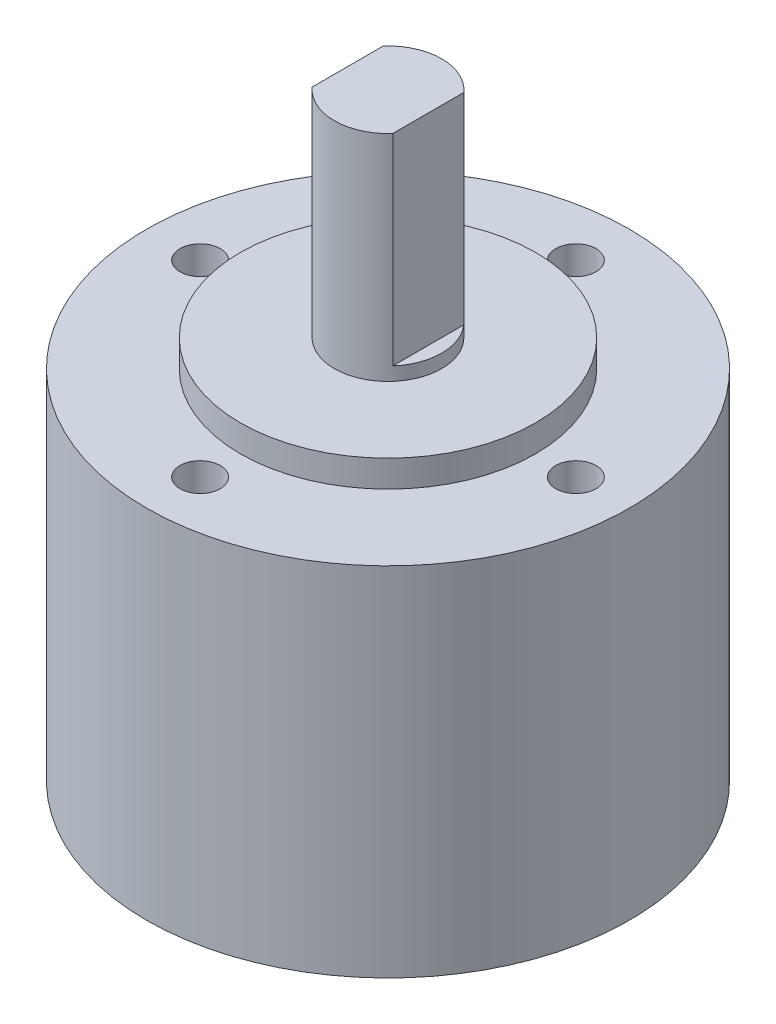
ISO-10303-21;
HEADER;
FILE_DESCRIPTION(('STEP AP214'),'2;1');
FILE_NAME('part.step','',(''),(''),'','','');
FILE_SCHEMA(('AUTOMOTIVE_DESIGN { 1 0 10303 214 1 1 1 1 }'));
ENDSEC;
DATA;
#1=APPLICATION_CONTEXT('core data for automotive mechanical design processes');
#2=APPLICATION_PROTOCOL_DEFINITION('international standard','automotive_design',2000,#1);
#3=PRODUCT_CONTEXT('',#1,'mechanical');
#4=PRODUCT('Part','Part','',(#3));
#5=PRODUCT_RELATED_PRODUCT_CATEGORY('part','',(#4));
#6=PRODUCT_DEFINITION_FORMATION('','',#4);
#7=PRODUCT_DEFINITION_CONTEXT('part definition',#1,'design');
#8=PRODUCT_DEFINITION('design','',#6,#7);
#9=PRODUCT_DEFINITION_SHAPE('','',#8);
#10=(LENGTH_UNIT() NAMED_UNIT(*) SI_UNIT(.MILLI.,.METRE.));
#11=(NAMED_UNIT(*) PLANE_ANGLE_UNIT() SI_UNIT($,.RADIAN.));
#12=(NAMED_UNIT(*) SI_UNIT($,.STERADIAN.) SOLID_ANGLE_UNIT());
#13=UNCERTAINTY_MEASURE_WITH_UNIT(LENGTH_MEASURE(1.E-05),#10,'distance_accuracy_value','');
#14=(GEOMETRIC_REPRESENTATION_CONTEXT(3) GLOBAL_UNCERTAINTY_ASSIGNED_CONTEXT((#13)) GLOBAL_UNIT_ASSIGNED_CONTEXT((#10,
#11,#12)) REPRESENTATION_CONTEXT('',''));
#15=CARTESIAN_POINT('',(0.,0.,0.));
#16=DIRECTION('',(0.,0.,1.));
#17=DIRECTION('',(1.,0.,0.));
#18=AXIS2_PLACEMENT_3D('',#15,#16,#17);
#19=CARTESIAN_POINT('',(0.,13.3,0.));
#20=DIRECTION('',(0.,-1.,0.));
#21=DIRECTION('',(0.,0.,-1.));
#22=AXIS2_PLACEMENT_3D('',#19,#20,#21);
#23=CYLINDRICAL_SURFACE('',#22,18.);
#24=CARTESIAN_POINT('',(0.,13.3,0.));
#25=DIRECTION('',(0.,1.,0.));
#26=DIRECTION('',(0.,0.,1.));
#27=AXIS2_PLACEMENT_3D('',#24,#25,#26);
#28=CIRCLE('',#27,18.);
#29=CARTESIAN_POINT('',(0.,13.3,18.));
#30=VERTEX_POINT('',#29);
#31=EDGE_CURVE('E113',#30,#30,#28,.T.);
#32=ORIENTED_EDGE('',*,*,#31,.F.);
#33=EDGE_LOOP('',(#32));
#34=FACE_BOUND('',#33,.T.);
#35=CARTESIAN_POINT('',(0.,-13.3,0.));
#36=DIRECTION('',(0.,1.,0.));
#37=DIRECTION('',(0.,0.,1.));
#38=AXIS2_PLACEMENT_3D('',#35,#36,#37);
#39=CIRCLE('',#38,18.);
#40=CARTESIAN_POINT('',(0.,-13.3,18.));
#41=VERTEX_POINT('',#40);
#42=EDGE_CURVE('E109',#41,#41,#39,.T.);
#43=ORIENTED_EDGE('',*,*,#42,.T.);
#44=EDGE_LOOP('',(#43));
#45=FACE_BOUND('',#44,.T.);
#46=ADVANCED_FACE('F42',(#34,#45),#23,.T.);
#47=CARTESIAN_POINT('',(0.,13.3,0.));
#48=DIRECTION('',(0.,1.,0.));
#49=DIRECTION('',(0.,0.,1.));
#50=AXIS2_PLACEMENT_3D('',#47,#48,#49);
#51=PLANE('',#50);
#52=CARTESIAN_POINT('',(-14.,13.3,0.));
#53=DIRECTION('',(0.,1.,0.));
#54=DIRECTION('',(0.,0.,1.));
#55=AXIS2_PLACEMENT_3D('',#52,#53,#54);
#56=CIRCLE('',#55,1.5);
#57=CARTESIAN_POINT('',(-14.,13.3,1.5));
#58=VERTEX_POINT('',#57);
#59=EDGE_CURVE('E125',#58,#58,#56,.T.);
#60=ORIENTED_EDGE('',*,*,#59,.F.);
#61=EDGE_LOOP('',(#60));
#62=FACE_BOUND('',#61,.T.);
#63=CARTESIAN_POINT('',(0.,13.3,14.));
#64=DIRECTION('',(0.,1.,0.));
#65=DIRECTION('',(0.,0.,1.));
#66=AXIS2_PLACEMENT_3D('',#63,#64,#65);
#67=CIRCLE('',#66,1.5);
#68=CARTESIAN_POINT('',(0.,13.3,15.5));
#69=VERTEX_POINT('',#68);
#70=EDGE_CURVE('E129',#69,#69,#67,.T.);
#71=ORIENTED_EDGE('',*,*,#70,.F.);
#72=EDGE_LOOP('',(#71));
#73=FACE_BOUND('',#72,.T.);
#74=CARTESIAN_POINT('',(14.,13.3,0.));
#75=DIRECTION('',(0.,1.,0.));
#76=DIRECTION('',(0.,0.,1.));
#77=AXIS2_PLACEMENT_3D('',#74,#75,#76);
#78=CIRCLE('',#77,1.5);
#79=CARTESIAN_POINT('',(14.,13.3,1.5));
#80=VERTEX_POINT('',#79);
#81=EDGE_CURVE('E133',#80,#80,#78,.T.);
#82=ORIENTED_EDGE('',*,*,#81,.F.);
#83=EDGE_LOOP('',(#82));
#84=FACE_BOUND('',#83,.T.);
#85=CARTESIAN_POINT('',(0.,13.3,-14.));
#86=DIRECTION('',(0.,1.,0.));
#87=DIRECTION('',(0.,0.,1.));
#88=AXIS2_PLACEMENT_3D('',#85,#86,#87);
#89=CIRCLE('',#88,1.5);
#90=CARTESIAN_POINT('',(0.,13.3,-12.5));
#91=VERTEX_POINT('',#90);
#92=EDGE_CURVE('E137',#91,#91,#89,.T.);
#93=ORIENTED_EDGE('',*,*,#92,.F.);
#94=EDGE_LOOP('',(#93));
#95=FACE_BOUND('',#94,.T.);
#96=CARTESIAN_POINT('',(0.,13.3,0.));
#97=DIRECTION('',(0.,1.,0.));
#98=DIRECTION('',(0.,0.,1.));
#99=AXIS2_PLACEMENT_3D('',#96,#97,#98);
#100=CIRCLE('',#99,11.);
#101=CARTESIAN_POINT('',(0.,13.3,11.));
#102=VERTEX_POINT('',#101);
#103=EDGE_CURVE('E118',#102,#102,#100,.T.);
#104=ORIENTED_EDGE('',*,*,#103,.F.);
#105=EDGE_LOOP('',(#104));
#106=FACE_BOUND('',#105,.T.);
#107=ORIENTED_EDGE('',*,*,#31,.T.);
#108=EDGE_LOOP('',(#107));
#109=FACE_BOUND('',#108,.T.);
#110=ADVANCED_FACE('F192',(#62,#73,#84,#95,#106,#109),#51,.T.);
#111=CARTESIAN_POINT('',(0.,-13.3,0.));
#112=DIRECTION('',(0.,1.,0.));
#113=DIRECTION('',(0.,0.,1.));
#114=AXIS2_PLACEMENT_3D('',#111,#112,#113);
#115=PLANE('',#114);
#116=CARTESIAN_POINT('',(-14.,-13.3,0.));
#117=DIRECTION('',(0.,1.,0.));
#118=DIRECTION('',(0.,0.,1.));
#119=AXIS2_PLACEMENT_3D('',#116,#117,#118);
#120=CIRCLE('',#119,1.5);
#121=CARTESIAN_POINT('',(-14.,-13.3,1.5));
#122=VERTEX_POINT('',#121);
#123=EDGE_CURVE('E141',#122,#122,#120,.T.);
#124=ORIENTED_EDGE('',*,*,#123,.T.);
#125=EDGE_LOOP('',(#124));
#126=FACE_BOUND('',#125,.T.);
#127=CARTESIAN_POINT('',(0.,-13.3,14.));
#128=DIRECTION('',(0.,1.,0.));
#129=DIRECTION('',(0.,0.,1.));
#130=AXIS2_PLACEMENT_3D('',#127,#128,#129);
#131=CIRCLE('',#130,1.5);
#132=CARTESIAN_POINT('',(0.,-13.3,15.5));
#133=VERTEX_POINT('',#132);
#134=EDGE_CURVE('E151',#133,#133,#131,.T.);
#135=ORIENTED_EDGE('',*,*,#134,.T.);
#136=EDGE_LOOP('',(#135));
#137=FACE_BOUND('',#136,.T.);
#138=CARTESIAN_POINT('',(14.,-13.3,0.));
#139=DIRECTION('',(0.,1.,0.));
#140=DIRECTION('',(0.,0.,1.));
#141=AXIS2_PLACEMENT_3D('',#138,#139,#140);
#142=CIRCLE('',#141,1.5);
#143=CARTESIAN_POINT('',(14.,-13.3,1.5));
#144=VERTEX_POINT('',#143);
#145=EDGE_CURVE('E146',#144,#144,#142,.T.);
#146=ORIENTED_EDGE('',*,*,#145,.T.);
#147=EDGE_LOOP('',(#146));
#148=FACE_BOUND('',#147,.T.);
#149=CARTESIAN_POINT('',(0.,-13.3,-14.));
#150=DIRECTION('',(0.,1.,0.));
#151=DIRECTION('',(0.,0.,1.));
#152=AXIS2_PLACEMENT_3D('',#149,#150,#151);
#153=CIRCLE('',#152,1.5);
#154=CARTESIAN_POINT('',(0.,-13.3,-12.5));
#155=VERTEX_POINT('',#154);
#156=EDGE_CURVE('E142',#155,#155,#153,.T.);
#157=ORIENTED_EDGE('',*,*,#156,.T.);
#158=EDGE_LOOP('',(#157));
#159=FACE_BOUND('',#158,.T.);
#160=ORIENTED_EDGE('',*,*,#42,.F.);
#161=EDGE_LOOP('',(#160));
#162=FACE_BOUND('',#161,.T.);
#163=ADVANCED_FACE('F197',(#126,#137,#148,#159,#162),#115,.F.);
#164=CARTESIAN_POINT('',(0.,15.3,0.));
#165=DIRECTION('',(0.,-1.,0.));
#166=DIRECTION('',(0.,0.,-1.));
#167=AXIS2_PLACEMENT_3D('',#164,#165,#166);
#168=CYLINDRICAL_SURFACE('',#167,11.);
#169=CARTESIAN_POINT('',(0.,15.3,0.));
#170=DIRECTION('',(0.,1.,0.));
#171=DIRECTION('',(0.,0.,1.));
#172=AXIS2_PLACEMENT_3D('',#169,#170,#171);
#173=CIRCLE('',#172,11.);
#174=CARTESIAN_POINT('',(0.,15.3,11.));
#175=VERTEX_POINT('',#174);
#176=EDGE_CURVE('E114',#175,#175,#173,.T.);
#177=ORIENTED_EDGE('',*,*,#176,.F.);
#178=EDGE_LOOP('',(#177));
#179=FACE_BOUND('',#178,.T.);
#180=ORIENTED_EDGE('',*,*,#103,.T.);
#181=EDGE_LOOP('',(#180));
#182=FACE_BOUND('',#181,.T.);
#183=ADVANCED_FACE('F205',(#179,#182),#168,.T.);
#184=CARTESIAN_POINT('',(0.,15.3,0.));
#185=DIRECTION('',(0.,1.,0.));
#186=DIRECTION('',(0.,0.,1.));
#187=AXIS2_PLACEMENT_3D('',#184,#185,#186);
#188=PLANE('',#187);
#189=CARTESIAN_POINT('',(0.,15.3,0.));
#190=DIRECTION('',(0.,1.,0.));
#191=DIRECTION('',(0.,0.,1.));
#192=AXIS2_PLACEMENT_3D('',#189,#190,#191);
#193=CIRCLE('',#192,4.);
#194=CARTESIAN_POINT('',(0.,15.3,4.));
#195=VERTEX_POINT('',#194);
#196=EDGE_CURVE('E108',#195,#195,#193,.T.);
#197=ORIENTED_EDGE('',*,*,#196,.F.);
#198=EDGE_LOOP('',(#197));
#199=FACE_BOUND('',#198,.T.);
#200=ORIENTED_EDGE('',*,*,#176,.T.);
#201=EDGE_LOOP('',(#200));
#202=FACE_BOUND('',#201,.T.);
#203=ADVANCED_FACE('F210',(#199,#202),#188,.T.);
#204=CARTESIAN_POINT('',(0.,-13.3,-14.));
#205=DIRECTION('',(0.,1.,0.));
#206=DIRECTION('',(0.,0.,1.));
#207=AXIS2_PLACEMENT_3D('',#204,#205,#206);
#208=CYLINDRICAL_SURFACE('',#207,1.5);
#209=ORIENTED_EDGE('',*,*,#92,.T.);
#210=EDGE_LOOP('',(#209));
#211=FACE_BOUND('',#210,.T.);
#212=ORIENTED_EDGE('',*,*,#156,.F.);
#213=EDGE_LOOP('',(#212));
#214=FACE_BOUND('',#213,.T.);
#215=ADVANCED_FACE('F217',(#211,#214),#208,.F.);
#216=CARTESIAN_POINT('',(14.,-13.3,0.));
#217=DIRECTION('',(0.,1.,0.));
#218=DIRECTION('',(0.,0.,1.));
#219=AXIS2_PLACEMENT_3D('',#216,#217,#218);
#220=CYLINDRICAL_SURFACE('',#219,1.5);
#221=ORIENTED_EDGE('',*,*,#81,.T.);
#222=EDGE_LOOP('',(#221));
#223=FACE_BOUND('',#222,.T.);
#224=ORIENTED_EDGE('',*,*,#145,.F.);
#225=EDGE_LOOP('',(#224));
#226=FACE_BOUND('',#225,.T.);
#227=ADVANCED_FACE('F221',(#223,#226),#220,.F.);
#228=CARTESIAN_POINT('',(0.,-13.3,14.));
#229=DIRECTION('',(0.,1.,0.));
#230=DIRECTION('',(0.,0.,1.));
#231=AXIS2_PLACEMENT_3D('',#228,#229,#230);
#232=CYLINDRICAL_SURFACE('',#231,1.5);
#233=ORIENTED_EDGE('',*,*,#70,.T.);
#234=EDGE_LOOP('',(#233));
#235=FACE_BOUND('',#234,.T.);
#236=ORIENTED_EDGE('',*,*,#134,.F.);
#237=EDGE_LOOP('',(#236));
#238=FACE_BOUND('',#237,.T.);
#239=ADVANCED_FACE('F225',(#235,#238),#232,.F.);
#240=CARTESIAN_POINT('',(-14.,-13.3,0.));
#241=DIRECTION('',(0.,1.,0.));
#242=DIRECTION('',(0.,0.,1.));
#243=AXIS2_PLACEMENT_3D('',#240,#241,#242);
#244=CYLINDRICAL_SURFACE('',#243,1.5);
#245=ORIENTED_EDGE('',*,*,#59,.T.);
#246=EDGE_LOOP('',(#245));
#247=FACE_BOUND('',#246,.T.);
#248=ORIENTED_EDGE('',*,*,#123,.F.);
#249=EDGE_LOOP('',(#248));
#250=FACE_BOUND('',#249,.T.);
#251=ADVANCED_FACE('F188',(#247,#250),#244,.F.);
#252=CARTESIAN_POINT('',(0.,31.3,0.));
#253=DIRECTION('',(0.,-1.,0.));
#254=DIRECTION('',(0.,0.,-1.));
#255=AXIS2_PLACEMENT_3D('',#252,#253,#254);
#256=CYLINDRICAL_SURFACE('',#255,4.);
#257=CARTESIAN_POINT('',(0.,31.3,0.));
#258=DIRECTION('',(0.,1.,0.));
#259=DIRECTION('',(0.,0.,1.));
#260=AXIS2_PLACEMENT_3D('',#257,#258,#259);
#261=CIRCLE('',#260,4.);
#262=CARTESIAN_POINT('',(-3.,31.3,2.64575131106459));
#263=VERTEX_POINT('',#262);
#264=CARTESIAN_POINT('',(3.,31.3,2.64575131106459));
#265=VERTEX_POINT('',#264);
#266=EDGE_CURVE('E161',#263,#265,#261,.T.);
#267=ORIENTED_EDGE('',*,*,#266,.F.);
#268=DIRECTION('',(0.,-1.,0.));
#269=VECTOR('',#268,1.);
#270=CARTESIAN_POINT('',(-3.,31.3,2.64575131106459));
#271=LINE('',#270,#269);
#272=CARTESIAN_POINT('',(-3.,16.3,2.64575131106459));
#273=VERTEX_POINT('',#272);
#274=EDGE_CURVE('E57',#263,#273,#271,.T.);
#275=ORIENTED_EDGE('',*,*,#274,.T.);
#276=CARTESIAN_POINT('',(0.,16.3,0.));
#277=DIRECTION('',(0.,1.,0.));
#278=DIRECTION('',(0.,0.,1.));
#279=AXIS2_PLACEMENT_3D('',#276,#277,#278);
#280=CIRCLE('',#279,4.);
#281=CARTESIAN_POINT('',(-3.,16.3,-2.64575131106459));
#282=VERTEX_POINT('',#281);
#283=EDGE_CURVE('E13',#282,#273,#280,.T.);
#284=ORIENTED_EDGE('',*,*,#283,.F.);
#285=DIRECTION('',(0.,-1.,0.));
#286=VECTOR('',#285,1.);
#287=CARTESIAN_POINT('',(-3.,31.3,-2.64575131106459));
#288=LINE('',#287,#286);
#289=CARTESIAN_POINT('',(-3.,31.3,-2.64575131106459));
#290=VERTEX_POINT('',#289);
#291=EDGE_CURVE('E166',#282,#290,#288,.F.);
#292=ORIENTED_EDGE('',*,*,#291,.T.);
#293=CARTESIAN_POINT('',(3.,31.3,-2.64575131106459));
#294=VERTEX_POINT('',#293);
#295=EDGE_CURVE('E147',#294,#290,#261,.T.);
#296=ORIENTED_EDGE('',*,*,#295,.F.);
#297=DIRECTION('',(0.,-1.,0.));
#298=VECTOR('',#297,1.);
#299=CARTESIAN_POINT('',(3.,31.3,-2.64575131106459));
#300=LINE('',#299,#298);
#301=CARTESIAN_POINT('',(3.,16.3,-2.64575131106459));
#302=VERTEX_POINT('',#301);
#303=EDGE_CURVE('E65',#294,#302,#300,.T.);
#304=ORIENTED_EDGE('',*,*,#303,.T.);
#305=CARTESIAN_POINT('',(0.,16.3,0.));
#306=DIRECTION('',(0.,1.,0.));
#307=DIRECTION('',(0.,0.,1.));
#308=AXIS2_PLACEMENT_3D('',#305,#306,#307);
#309=CIRCLE('',#308,4.);
#310=CARTESIAN_POINT('',(3.,16.3,2.64575131106459));
#311=VERTEX_POINT('',#310);
#312=EDGE_CURVE('E50',#311,#302,#309,.T.);
#313=ORIENTED_EDGE('',*,*,#312,.F.);
#314=DIRECTION('',(0.,-1.,0.));
#315=VECTOR('',#314,1.);
#316=CARTESIAN_POINT('',(3.,31.3,2.64575131106459));
#317=LINE('',#316,#315);
#318=EDGE_CURVE('E82',#311,#265,#317,.F.);
#319=ORIENTED_EDGE('',*,*,#318,.T.);
#320=EDGE_LOOP('',(#267,#275,#284,#292,#296,#304,#313,#319));
#321=FACE_BOUND('',#320,.T.);
#322=ORIENTED_EDGE('',*,*,#196,.T.);
#323=EDGE_LOOP('',(#322));
#324=FACE_BOUND('',#323,.T.);
#325=ADVANCED_FACE('F98',(#321,#324),#256,.T.);
#326=CARTESIAN_POINT('',(0.,31.3,0.));
#327=DIRECTION('',(0.,1.,0.));
#328=DIRECTION('',(0.,0.,1.));
#329=AXIS2_PLACEMENT_3D('',#326,#327,#328);
#330=PLANE('',#329);
#331=DIRECTION('',(0.,0.,-1.));
#332=VECTOR('',#331,1.);
#333=CARTESIAN_POINT('',(-3.,31.3,0.));
#334=LINE('',#333,#332);
#335=EDGE_CURVE('E102',#263,#290,#334,.T.);
#336=ORIENTED_EDGE('',*,*,#335,.F.);
#337=ORIENTED_EDGE('',*,*,#266,.T.);
#338=DIRECTION('',(0.,0.,1.));
#339=VECTOR('',#338,1.);
#340=CARTESIAN_POINT('',(3.,31.3,0.));
#341=LINE('',#340,#339);
#342=EDGE_CURVE('E86',#294,#265,#341,.T.);
#343=ORIENTED_EDGE('',*,*,#342,.F.);
#344=ORIENTED_EDGE('',*,*,#295,.T.);
#345=EDGE_LOOP('',(#336,#337,#343,#344));
#346=FACE_BOUND('',#345,.T.);
#347=ADVANCED_FACE('F178',(#346),#330,.T.);
#348=CARTESIAN_POINT('',(0.,16.3,0.));
#349=DIRECTION('',(0.,1.,0.));
#350=DIRECTION('',(0.,0.,1.));
#351=AXIS2_PLACEMENT_3D('',#348,#349,#350);
#352=PLANE('',#351);
#353=ORIENTED_EDGE('',*,*,#312,.T.);
#354=DIRECTION('',(0.,0.,-1.));
#355=VECTOR('',#354,1.);
#356=CARTESIAN_POINT('',(3.,16.3,4.));
#357=LINE('',#356,#355);
#358=EDGE_CURVE('E85',#311,#302,#357,.T.);
#359=ORIENTED_EDGE('',*,*,#358,.F.);
#360=EDGE_LOOP('',(#353,#359));
#361=FACE_BOUND('',#360,.T.);
#362=ADVANCED_FACE('F95',(#361),#352,.T.);
#363=CARTESIAN_POINT('',(3.,7.05378874876468,4.));
#364=DIRECTION('',(-1.,0.,0.));
#365=DIRECTION('',(0.,0.,1.));
#366=AXIS2_PLACEMENT_3D('',#363,#364,#365);
#367=PLANE('',#366);
#368=ORIENTED_EDGE('',*,*,#342,.T.);
#369=ORIENTED_EDGE('',*,*,#318,.F.);
#370=ORIENTED_EDGE('',*,*,#358,.T.);
#371=ORIENTED_EDGE('',*,*,#303,.F.);
#372=EDGE_LOOP('',(#368,#369,#370,#371));
#373=FACE_BOUND('',#372,.T.);
#374=ADVANCED_FACE('F84',(#373),#367,.F.);
#375=CARTESIAN_POINT('',(0.,16.3,0.));
#376=DIRECTION('',(0.,1.,0.));
#377=DIRECTION('',(0.,0.,1.));
#378=AXIS2_PLACEMENT_3D('',#375,#376,#377);
#379=PLANE('',#378);
#380=ORIENTED_EDGE('',*,*,#283,.T.);
#381=DIRECTION('',(0.,0.,1.));
#382=VECTOR('',#381,1.);
#383=CARTESIAN_POINT('',(-3.,16.3,4.));
#384=LINE('',#383,#382);
#385=EDGE_CURVE('E92',#282,#273,#384,.T.);
#386=ORIENTED_EDGE('',*,*,#385,.F.);
#387=EDGE_LOOP('',(#380,#386));
#388=FACE_BOUND('',#387,.T.);
#389=ADVANCED_FACE('F283',(#388),#379,.T.);
#390=CARTESIAN_POINT('',(-3.,7.05378874876468,4.));
#391=DIRECTION('',(1.,0.,0.));
#392=DIRECTION('',(0.,0.,-1.));
#393=AXIS2_PLACEMENT_3D('',#390,#391,#392);
#394=PLANE('',#393);
#395=ORIENTED_EDGE('',*,*,#335,.T.);
#396=ORIENTED_EDGE('',*,*,#291,.F.);
#397=ORIENTED_EDGE('',*,*,#385,.T.);
#398=ORIENTED_EDGE('',*,*,#274,.F.);
#399=EDGE_LOOP('',(#395,#396,#397,#398));
#400=FACE_BOUND('',#399,.T.);
#401=ADVANCED_FACE('F174',(#400),#394,.F.);
#402=CLOSED_SHELL('',(#46,#110,#163,#183,#203,#215,#227,#239,#251,#325,#347,#362,#374,#389,#401));
#403=MANIFOLD_SOLID_BREP('B2',#402);
#404=ADVANCED_BREP_SHAPE_REPRESENTATION('',(#18,#403),#14);
#405=SHAPE_DEFINITION_REPRESENTATION(#9,#404);
ENDSEC;
END-ISO-10303-21;
